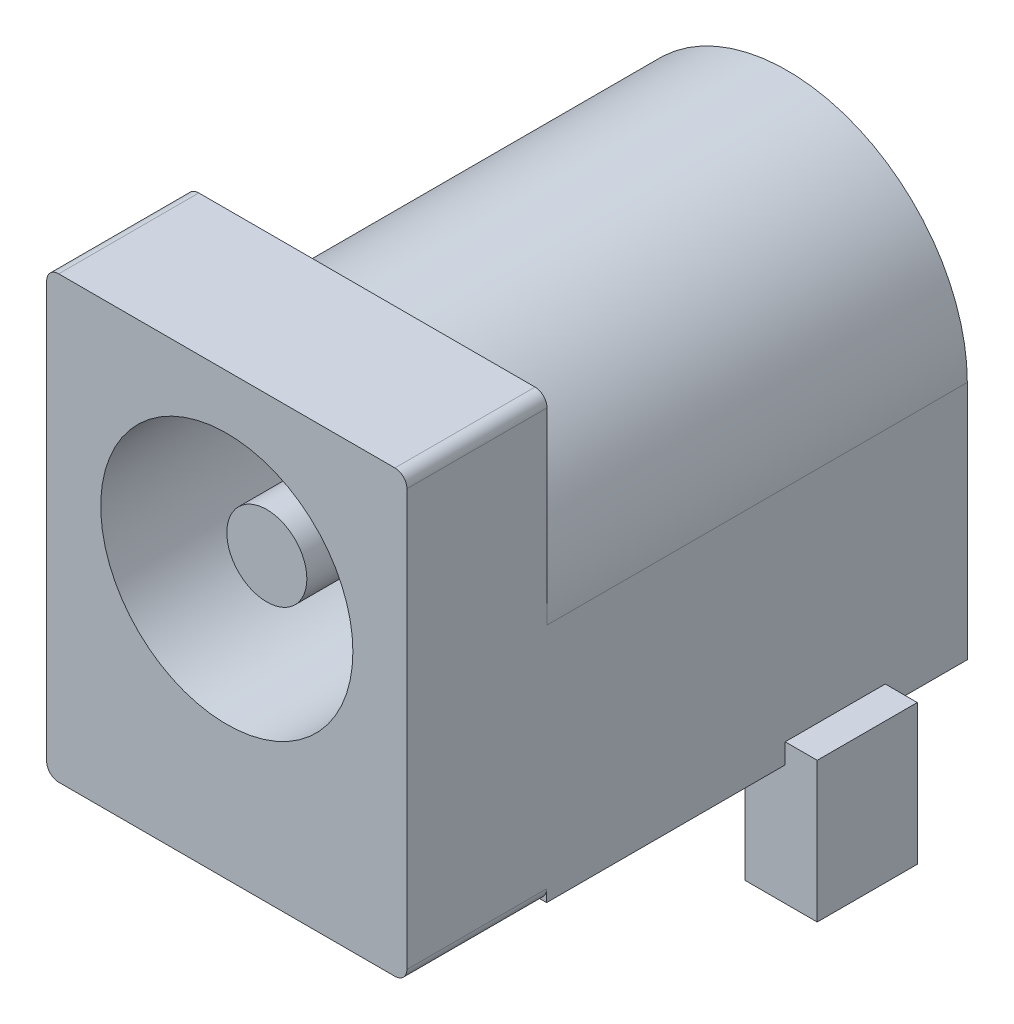
ISO-10303-21;
HEADER;
FILE_DESCRIPTION(('STEP AP214'),'2;1');
FILE_NAME('part.step','',(''),(''),'','','');
FILE_SCHEMA(('AUTOMOTIVE_DESIGN { 1 0 10303 214 1 1 1 1 }'));
ENDSEC;
DATA;
#1=APPLICATION_CONTEXT('core data for automotive mechanical design processes');
#2=APPLICATION_PROTOCOL_DEFINITION('international standard','automotive_design',2000,#1);
#3=PRODUCT_CONTEXT('',#1,'mechanical');
#4=PRODUCT('Part','Part','',(#3));
#5=PRODUCT_RELATED_PRODUCT_CATEGORY('part','',(#4));
#6=PRODUCT_DEFINITION_FORMATION('','',#4);
#7=PRODUCT_DEFINITION_CONTEXT('part definition',#1,'design');
#8=PRODUCT_DEFINITION('design','',#6,#7);
#9=PRODUCT_DEFINITION_SHAPE('','',#8);
#10=(LENGTH_UNIT() NAMED_UNIT(*) SI_UNIT(.MILLI.,.METRE.));
#11=(NAMED_UNIT(*) PLANE_ANGLE_UNIT() SI_UNIT($,.RADIAN.));
#12=(NAMED_UNIT(*) SI_UNIT($,.STERADIAN.) SOLID_ANGLE_UNIT());
#13=UNCERTAINTY_MEASURE_WITH_UNIT(LENGTH_MEASURE(1.E-05),#10,'distance_accuracy_value','');
#14=(GEOMETRIC_REPRESENTATION_CONTEXT(3) GLOBAL_UNCERTAINTY_ASSIGNED_CONTEXT((#13)) GLOBAL_UNIT_ASSIGNED_CONTEXT((#10,
#11,#12)) REPRESENTATION_CONTEXT('',''));
#15=CARTESIAN_POINT('',(0.,0.,0.));
#16=DIRECTION('',(0.,0.,1.));
#17=DIRECTION('',(1.,0.,0.));
#18=AXIS2_PLACEMENT_3D('',#15,#16,#17);
#19=CARTESIAN_POINT('',(0.,0.,-1.8));
#20=DIRECTION('',(0.,0.,1.));
#21=DIRECTION('',(1.,0.,0.));
#22=AXIS2_PLACEMENT_3D('',#19,#20,#21);
#23=PLANE('',#22);
#24=CARTESIAN_POINT('',(0.,0.,-1.8));
#25=DIRECTION('',(0.,0.,1.));
#26=DIRECTION('',(1.,0.,0.));
#27=AXIS2_PLACEMENT_3D('',#24,#25,#26);
#28=CIRCLE('',#27,1.);
#29=CARTESIAN_POINT('',(1.,0.,-1.8));
#30=VERTEX_POINT('',#29);
#31=EDGE_CURVE('E11',#30,#30,#28,.T.);
#32=ORIENTED_EDGE('',*,*,#31,.T.);
#33=EDGE_LOOP('',(#32));
#34=FACE_BOUND('',#33,.T.);
#35=ADVANCED_FACE('F17',(#34),#23,.T.);
#36=CARTESIAN_POINT('',(0.,0.,-10.5));
#37=DIRECTION('',(0.,0.,-1.));
#38=DIRECTION('',(1.,0.,0.));
#39=AXIS2_PLACEMENT_3D('',#36,#37,#38);
#40=CYLINDRICAL_SURFACE('',#39,1.);
#41=ORIENTED_EDGE('',*,*,#31,.F.);
#42=EDGE_LOOP('',(#41));
#43=FACE_BOUND('',#42,.T.);
#44=CARTESIAN_POINT('',(0.,0.,-10.4));
#45=DIRECTION('',(0.,0.,-1.));
#46=DIRECTION('',(1.,0.,0.));
#47=AXIS2_PLACEMENT_3D('',#44,#45,#46);
#48=CIRCLE('',#47,1.);
#49=CARTESIAN_POINT('',(1.,0.,-10.4));
#50=VERTEX_POINT('',#49);
#51=EDGE_CURVE('E313',#50,#50,#48,.T.);
#52=ORIENTED_EDGE('',*,*,#51,.F.);
#53=EDGE_LOOP('',(#52));
#54=FACE_BOUND('',#53,.T.);
#55=ADVANCED_FACE('F897',(#43,#54),#40,.T.);
#56=CARTESIAN_POINT('',(-0.4,-9.5,-10.));
#57=DIRECTION('',(0.,1.,0.));
#58=DIRECTION('',(1.,0.,0.));
#59=AXIS2_PLACEMENT_3D('',#56,#57,#58);
#60=PLANE('',#59);
#61=DIRECTION('',(0.,0.,1.));
#62=VECTOR('',#61,1.);
#63=CARTESIAN_POINT('',(0.4,-9.5,-10.));
#64=LINE('',#63,#62);
#65=CARTESIAN_POINT('',(0.4,-9.5,-10.));
#66=VERTEX_POINT('',#65);
#67=CARTESIAN_POINT('',(0.4,-9.5,-7.2));
#68=VERTEX_POINT('',#67);
#69=EDGE_CURVE('E225',#66,#68,#64,.T.);
#70=ORIENTED_EDGE('',*,*,#69,.T.);
#71=DIRECTION('',(1.,0.,0.));
#72=VECTOR('',#71,1.);
#73=CARTESIAN_POINT('',(-0.4,-9.5,-7.2));
#74=LINE('',#73,#72);
#75=CARTESIAN_POINT('',(-0.4,-9.5,-7.2));
#76=VERTEX_POINT('',#75);
#77=EDGE_CURVE('E304',#76,#68,#74,.T.);
#78=ORIENTED_EDGE('',*,*,#77,.F.);
#79=DIRECTION('',(0.,0.,1.));
#80=VECTOR('',#79,1.);
#81=CARTESIAN_POINT('',(-0.4,-9.5,-10.));
#82=LINE('',#81,#80);
#83=CARTESIAN_POINT('',(-0.4,-9.5,-10.));
#84=VERTEX_POINT('',#83);
#85=EDGE_CURVE('E235',#84,#76,#82,.T.);
#86=ORIENTED_EDGE('',*,*,#85,.F.);
#87=DIRECTION('',(1.,0.,0.));
#88=VECTOR('',#87,1.);
#89=CARTESIAN_POINT('',(-0.4,-9.5,-10.));
#90=LINE('',#89,#88);
#91=EDGE_CURVE('E36',#84,#66,#90,.T.);
#92=ORIENTED_EDGE('',*,*,#91,.T.);
#93=EDGE_LOOP('',(#70,#78,#86,#92));
#94=FACE_BOUND('',#93,.T.);
#95=ADVANCED_FACE('F903',(#94),#60,.F.);
#96=CARTESIAN_POINT('',(3.5,-9.5,-12.75));
#97=DIRECTION('',(0.,1.,0.));
#98=DIRECTION('',(1.,0.,0.));
#99=AXIS2_PLACEMENT_3D('',#96,#97,#98);
#100=PLANE('',#99);
#101=DIRECTION('',(0.,0.,1.));
#102=VECTOR('',#101,1.);
#103=CARTESIAN_POINT('',(5.3,-9.5,-12.75));
#104=LINE('',#103,#102);
#105=CARTESIAN_POINT('',(5.3,-9.5,-12.75));
#106=VERTEX_POINT('',#105);
#107=CARTESIAN_POINT('',(5.3,-9.5,-10.25));
#108=VERTEX_POINT('',#107);
#109=EDGE_CURVE('E27',#106,#108,#104,.T.);
#110=ORIENTED_EDGE('',*,*,#109,.T.);
#111=DIRECTION('',(1.,0.,0.));
#112=VECTOR('',#111,1.);
#113=CARTESIAN_POINT('',(3.5,-9.5,-10.25));
#114=LINE('',#113,#112);
#115=CARTESIAN_POINT('',(3.5,-9.5,-10.25));
#116=VERTEX_POINT('',#115);
#117=EDGE_CURVE('E392',#116,#108,#114,.T.);
#118=ORIENTED_EDGE('',*,*,#117,.F.);
#119=DIRECTION('',(0.,0.,1.));
#120=VECTOR('',#119,1.);
#121=CARTESIAN_POINT('',(3.5,-9.5,-12.75));
#122=LINE('',#121,#120);
#123=CARTESIAN_POINT('',(3.5,-9.5,-12.75));
#124=VERTEX_POINT('',#123);
#125=EDGE_CURVE('E485',#124,#116,#122,.T.);
#126=ORIENTED_EDGE('',*,*,#125,.F.);
#127=DIRECTION('',(1.,0.,0.));
#128=VECTOR('',#127,1.);
#129=CARTESIAN_POINT('',(3.5,-9.5,-12.75));
#130=LINE('',#129,#128);
#131=EDGE_CURVE('E459',#124,#106,#130,.T.);
#132=ORIENTED_EDGE('',*,*,#131,.T.);
#133=EDGE_LOOP('',(#110,#118,#126,#132));
#134=FACE_BOUND('',#133,.T.);
#135=ADVANCED_FACE('F586',(#134),#100,.F.);
#136=CARTESIAN_POINT('',(5.3,-9.5,-12.75));
#137=DIRECTION('',(1.,0.,0.));
#138=DIRECTION('',(0.,1.,0.));
#139=AXIS2_PLACEMENT_3D('',#136,#137,#138);
#140=PLANE('',#139);
#141=ORIENTED_EDGE('',*,*,#109,.F.);
#142=DIRECTION('',(0.,1.,0.));
#143=VECTOR('',#142,1.);
#144=CARTESIAN_POINT('',(5.3,-9.5,-12.75));
#145=LINE('',#144,#143);
#146=CARTESIAN_POINT('',(5.3,-6.,-12.75));
#147=VERTEX_POINT('',#146);
#148=EDGE_CURVE('E464',#106,#147,#145,.T.);
#149=ORIENTED_EDGE('',*,*,#148,.T.);
#150=DIRECTION('',(0.,0.,1.));
#151=VECTOR('',#150,1.);
#152=CARTESIAN_POINT('',(5.3,-6.,-12.75));
#153=LINE('',#152,#151);
#154=CARTESIAN_POINT('',(5.3,-6.,-10.25));
#155=VERTEX_POINT('',#154);
#156=EDGE_CURVE('E316',#147,#155,#153,.T.);
#157=ORIENTED_EDGE('',*,*,#156,.T.);
#158=DIRECTION('',(0.,1.,0.));
#159=VECTOR('',#158,1.);
#160=CARTESIAN_POINT('',(5.3,-9.5,-10.25));
#161=LINE('',#160,#159);
#162=EDGE_CURVE('E389',#108,#155,#161,.T.);
#163=ORIENTED_EDGE('',*,*,#162,.F.);
#164=EDGE_LOOP('',(#141,#149,#157,#163));
#165=FACE_BOUND('',#164,.T.);
#166=ADVANCED_FACE('F580',(#165),#140,.T.);
#167=CARTESIAN_POINT('',(-0.4,-9.5,-15.9));
#168=DIRECTION('',(0.,1.,0.));
#169=DIRECTION('',(1.,0.,0.));
#170=AXIS2_PLACEMENT_3D('',#167,#168,#169);
#171=PLANE('',#170);
#172=DIRECTION('',(0.,0.,1.));
#173=VECTOR('',#172,1.);
#174=CARTESIAN_POINT('',(0.4,-9.5,-15.9));
#175=LINE('',#174,#173);
#176=CARTESIAN_POINT('',(0.4,-9.5,-15.9));
#177=VERTEX_POINT('',#176);
#178=CARTESIAN_POINT('',(0.4,-9.5,-12.9));
#179=VERTEX_POINT('',#178);
#180=EDGE_CURVE('E337',#177,#179,#175,.T.);
#181=ORIENTED_EDGE('',*,*,#180,.T.);
#182=DIRECTION('',(1.,0.,0.));
#183=VECTOR('',#182,1.);
#184=CARTESIAN_POINT('',(-0.4,-9.5,-12.9));
#185=LINE('',#184,#183);
#186=CARTESIAN_POINT('',(-0.4,-9.5,-12.9));
#187=VERTEX_POINT('',#186);
#188=EDGE_CURVE('E422',#187,#179,#185,.T.);
#189=ORIENTED_EDGE('',*,*,#188,.F.);
#190=DIRECTION('',(0.,0.,1.));
#191=VECTOR('',#190,1.);
#192=CARTESIAN_POINT('',(-0.4,-9.5,-15.9));
#193=LINE('',#192,#191);
#194=CARTESIAN_POINT('',(-0.4,-9.5,-15.9));
#195=VERTEX_POINT('',#194);
#196=EDGE_CURVE('E500',#195,#187,#193,.T.);
#197=ORIENTED_EDGE('',*,*,#196,.F.);
#198=DIRECTION('',(1.,0.,0.));
#199=VECTOR('',#198,1.);
#200=CARTESIAN_POINT('',(-0.4,-9.5,-15.9));
#201=LINE('',#200,#199);
#202=EDGE_CURVE('E312',#195,#177,#201,.T.);
#203=ORIENTED_EDGE('',*,*,#202,.T.);
#204=EDGE_LOOP('',(#181,#189,#197,#203));
#205=FACE_BOUND('',#204,.T.);
#206=ADVANCED_FACE('F627',(#205),#171,.F.);
#207=CARTESIAN_POINT('',(-0.4,-9.5,-15.9));
#208=DIRECTION('',(0.,0.,1.));
#209=DIRECTION('',(1.,0.,0.));
#210=AXIS2_PLACEMENT_3D('',#207,#208,#209);
#211=PLANE('',#210);
#212=DIRECTION('',(1.,0.,0.));
#213=VECTOR('',#212,1.);
#214=CARTESIAN_POINT('',(-0.4,-6.,-15.9));
#215=LINE('',#214,#213);
#216=CARTESIAN_POINT('',(-0.4,-6.,-15.9));
#217=VERTEX_POINT('',#216);
#218=CARTESIAN_POINT('',(0.4,-6.,-15.9));
#219=VERTEX_POINT('',#218);
#220=EDGE_CURVE('E535',#217,#219,#215,.T.);
#221=ORIENTED_EDGE('',*,*,#220,.T.);
#222=DIRECTION('',(0.,1.,0.));
#223=VECTOR('',#222,1.);
#224=CARTESIAN_POINT('',(0.4,-9.5,-15.9));
#225=LINE('',#224,#223);
#226=EDGE_CURVE('E335',#177,#219,#225,.T.);
#227=ORIENTED_EDGE('',*,*,#226,.F.);
#228=ORIENTED_EDGE('',*,*,#202,.F.);
#229=DIRECTION('',(0.,1.,0.));
#230=VECTOR('',#229,1.);
#231=CARTESIAN_POINT('',(-0.4,-9.5,-15.9));
#232=LINE('',#231,#230);
#233=EDGE_CURVE('E533',#195,#217,#232,.T.);
#234=ORIENTED_EDGE('',*,*,#233,.T.);
#235=EDGE_LOOP('',(#221,#227,#228,#234));
#236=FACE_BOUND('',#235,.T.);
#237=ADVANCED_FACE('F634',(#236),#211,.F.);
#238=CARTESIAN_POINT('',(0.,0.,-10.4));
#239=DIRECTION('',(0.,0.,1.));
#240=DIRECTION('',(1.,0.,0.));
#241=AXIS2_PLACEMENT_3D('',#238,#239,#240);
#242=PLANE('',#241);
#243=ORIENTED_EDGE('',*,*,#51,.T.);
#244=EDGE_LOOP('',(#243));
#245=FACE_BOUND('',#244,.T.);
#246=CARTESIAN_POINT('',(0.,0.,-10.4));
#247=DIRECTION('',(0.,0.,1.));
#248=DIRECTION('',(1.,0.,0.));
#249=AXIS2_PLACEMENT_3D('',#246,#247,#248);
#250=CIRCLE('',#249,3.15);
#251=CARTESIAN_POINT('',(3.15,0.,-10.4));
#252=VERTEX_POINT('',#251);
#253=EDGE_CURVE('E521',#252,#252,#250,.T.);
#254=ORIENTED_EDGE('',*,*,#253,.T.);
#255=EDGE_LOOP('',(#254));
#256=FACE_BOUND('',#255,.T.);
#257=ADVANCED_FACE('F1033',(#245,#256),#242,.T.);
#258=CARTESIAN_POINT('',(3.5,-6.,-12.75));
#259=DIRECTION('',(0.,1.,0.));
#260=DIRECTION('',(1.,0.,0.));
#261=AXIS2_PLACEMENT_3D('',#258,#259,#260);
#262=PLANE('',#261);
#263=DIRECTION('',(1.,0.,0.));
#264=VECTOR('',#263,1.);
#265=CARTESIAN_POINT('',(3.5,-6.,-12.75));
#266=LINE('',#265,#264);
#267=CARTESIAN_POINT('',(4.5,-6.,-12.75));
#268=VERTEX_POINT('',#267);
#269=EDGE_CURVE('E546',#268,#147,#266,.T.);
#270=ORIENTED_EDGE('',*,*,#269,.F.);
#271=DIRECTION('',(0.,0.,1.));
#272=VECTOR('',#271,1.);
#273=CARTESIAN_POINT('',(4.5,-6.,-8.525));
#274=LINE('',#273,#272);
#275=CARTESIAN_POINT('',(4.5,-6.,-10.25));
#276=VERTEX_POINT('',#275);
#277=EDGE_CURVE('E520',#268,#276,#274,.T.);
#278=ORIENTED_EDGE('',*,*,#277,.T.);
#279=DIRECTION('',(1.,0.,0.));
#280=VECTOR('',#279,1.);
#281=CARTESIAN_POINT('',(3.5,-6.,-10.25));
#282=LINE('',#281,#280);
#283=EDGE_CURVE('E301',#276,#155,#282,.T.);
#284=ORIENTED_EDGE('',*,*,#283,.T.);
#285=ORIENTED_EDGE('',*,*,#156,.F.);
#286=EDGE_LOOP('',(#270,#278,#284,#285));
#287=FACE_BOUND('',#286,.T.);
#288=ADVANCED_FACE('F578',(#287),#262,.T.);
#289=CARTESIAN_POINT('',(-0.4,-6.,-15.9));
#290=DIRECTION('',(0.,1.,0.));
#291=DIRECTION('',(1.,0.,0.));
#292=AXIS2_PLACEMENT_3D('',#289,#290,#291);
#293=PLANE('',#292);
#294=DIRECTION('',(0.,0.,1.));
#295=VECTOR('',#294,1.);
#296=CARTESIAN_POINT('',(0.4,-6.,-15.9));
#297=LINE('',#296,#295);
#298=CARTESIAN_POINT('',(0.4,-6.,-14.8));
#299=VERTEX_POINT('',#298);
#300=EDGE_CURVE('E336',#219,#299,#297,.T.);
#301=ORIENTED_EDGE('',*,*,#300,.F.);
#302=ORIENTED_EDGE('',*,*,#220,.F.);
#303=DIRECTION('',(0.,0.,1.));
#304=VECTOR('',#303,1.);
#305=CARTESIAN_POINT('',(-0.4,-6.,-15.9));
#306=LINE('',#305,#304);
#307=CARTESIAN_POINT('',(-0.4,-6.,-14.8));
#308=VERTEX_POINT('',#307);
#309=EDGE_CURVE('E526',#217,#308,#306,.T.);
#310=ORIENTED_EDGE('',*,*,#309,.T.);
#311=DIRECTION('',(-1.,0.,0.));
#312=VECTOR('',#311,1.);
#313=CARTESIAN_POINT('',(-2.45,-6.,-14.8));
#314=LINE('',#313,#312);
#315=EDGE_CURVE('E444',#299,#308,#314,.T.);
#316=ORIENTED_EDGE('',*,*,#315,.F.);
#317=EDGE_LOOP('',(#301,#302,#310,#316));
#318=FACE_BOUND('',#317,.T.);
#319=ADVANCED_FACE('F633',(#318),#293,.T.);
#320=CARTESIAN_POINT('',(-0.4,-9.5,-10.));
#321=DIRECTION('',(0.,0.,1.));
#322=DIRECTION('',(1.,0.,0.));
#323=AXIS2_PLACEMENT_3D('',#320,#321,#322);
#324=PLANE('',#323);
#325=DIRECTION('',(1.,0.,0.));
#326=VECTOR('',#325,1.);
#327=CARTESIAN_POINT('',(-2.45,-6.5,-10.));
#328=LINE('',#327,#326);
#329=CARTESIAN_POINT('',(-0.4,-6.5,-10.));
#330=VERTEX_POINT('',#329);
#331=CARTESIAN_POINT('',(0.4,-6.5,-10.));
#332=VERTEX_POINT('',#331);
#333=EDGE_CURVE('E319',#330,#332,#328,.T.);
#334=ORIENTED_EDGE('',*,*,#333,.T.);
#335=DIRECTION('',(0.,1.,0.));
#336=VECTOR('',#335,1.);
#337=CARTESIAN_POINT('',(0.4,-9.5,-10.));
#338=LINE('',#337,#336);
#339=EDGE_CURVE('E506',#66,#332,#338,.T.);
#340=ORIENTED_EDGE('',*,*,#339,.F.);
#341=ORIENTED_EDGE('',*,*,#91,.F.);
#342=DIRECTION('',(0.,1.,0.));
#343=VECTOR('',#342,1.);
#344=CARTESIAN_POINT('',(-0.4,-9.5,-10.));
#345=LINE('',#344,#343);
#346=EDGE_CURVE('E383',#84,#330,#345,.T.);
#347=ORIENTED_EDGE('',*,*,#346,.T.);
#348=EDGE_LOOP('',(#334,#340,#341,#347));
#349=FACE_BOUND('',#348,.T.);
#350=ADVANCED_FACE('F1007',(#349),#324,.F.);
#351=CARTESIAN_POINT('',(0.4,-9.5,-10.));
#352=DIRECTION('',(1.,0.,0.));
#353=DIRECTION('',(0.,1.,0.));
#354=AXIS2_PLACEMENT_3D('',#351,#352,#353);
#355=PLANE('',#354);
#356=DIRECTION('',(0.,1.,0.));
#357=VECTOR('',#356,1.);
#358=CARTESIAN_POINT('',(0.4,-9.5,-7.2));
#359=LINE('',#358,#357);
#360=CARTESIAN_POINT('',(0.4,-6.5,-7.2));
#361=VERTEX_POINT('',#360);
#362=EDGE_CURVE('E381',#68,#361,#359,.T.);
#363=ORIENTED_EDGE('',*,*,#362,.F.);
#364=ORIENTED_EDGE('',*,*,#69,.F.);
#365=ORIENTED_EDGE('',*,*,#339,.T.);
#366=DIRECTION('',(0.,0.,-1.));
#367=VECTOR('',#366,1.);
#368=CARTESIAN_POINT('',(0.4,-6.5,-7.15));
#369=LINE('',#368,#367);
#370=EDGE_CURVE('E324',#361,#332,#369,.T.);
#371=ORIENTED_EDGE('',*,*,#370,.F.);
#372=EDGE_LOOP('',(#363,#364,#365,#371));
#373=FACE_BOUND('',#372,.T.);
#374=ADVANCED_FACE('F1001',(#373),#355,.T.);
#375=CARTESIAN_POINT('',(-0.4,-9.5,-10.));
#376=DIRECTION('',(1.,0.,0.));
#377=DIRECTION('',(0.,1.,0.));
#378=AXIS2_PLACEMENT_3D('',#375,#376,#377);
#379=PLANE('',#378);
#380=DIRECTION('',(0.,0.,-1.));
#381=VECTOR('',#380,1.);
#382=CARTESIAN_POINT('',(-0.4,-6.5,-7.15));
#383=LINE('',#382,#381);
#384=CARTESIAN_POINT('',(-0.4,-6.5,-7.2));
#385=VERTEX_POINT('',#384);
#386=EDGE_CURVE('E322',#385,#330,#383,.T.);
#387=ORIENTED_EDGE('',*,*,#386,.T.);
#388=ORIENTED_EDGE('',*,*,#346,.F.);
#389=ORIENTED_EDGE('',*,*,#85,.T.);
#390=DIRECTION('',(0.,1.,0.));
#391=VECTOR('',#390,1.);
#392=CARTESIAN_POINT('',(-0.4,-9.5,-7.2));
#393=LINE('',#392,#391);
#394=EDGE_CURVE('E299',#76,#385,#393,.T.);
#395=ORIENTED_EDGE('',*,*,#394,.T.);
#396=EDGE_LOOP('',(#387,#388,#389,#395));
#397=FACE_BOUND('',#396,.T.);
#398=ADVANCED_FACE('F995',(#397),#379,.F.);
#399=CARTESIAN_POINT('',(-0.4,-9.5,-7.2));
#400=DIRECTION('',(0.,0.,1.));
#401=DIRECTION('',(1.,0.,0.));
#402=AXIS2_PLACEMENT_3D('',#399,#400,#401);
#403=PLANE('',#402);
#404=ORIENTED_EDGE('',*,*,#394,.F.);
#405=ORIENTED_EDGE('',*,*,#77,.T.);
#406=ORIENTED_EDGE('',*,*,#362,.T.);
#407=DIRECTION('',(1.,0.,0.));
#408=VECTOR('',#407,1.);
#409=CARTESIAN_POINT('',(-2.45,-6.5,-7.2));
#410=LINE('',#409,#408);
#411=EDGE_CURVE('E355',#385,#361,#410,.T.);
#412=ORIENTED_EDGE('',*,*,#411,.F.);
#413=EDGE_LOOP('',(#404,#405,#406,#412));
#414=FACE_BOUND('',#413,.T.);
#415=ADVANCED_FACE('F983',(#414),#403,.T.);
#416=CARTESIAN_POINT('',(-4.5,-6.5,-4.29));
#417=DIRECTION('',(0.,0.,1.));
#418=DIRECTION('',(1.,0.,0.));
#419=AXIS2_PLACEMENT_3D('',#416,#417,#418);
#420=PLANE('',#419);
#421=DIRECTION('',(1.,0.,0.));
#422=VECTOR('',#421,1.);
#423=CARTESIAN_POINT('',(-4.5,-6.5,-4.29));
#424=LINE('',#423,#422);
#425=CARTESIAN_POINT('',(4.2,-6.5,-4.29));
#426=VERTEX_POINT('',#425);
#427=CARTESIAN_POINT('',(4.5,-6.5,-4.29));
#428=VERTEX_POINT('',#427);
#429=EDGE_CURVE('E450',#426,#428,#424,.T.);
#430=ORIENTED_EDGE('',*,*,#429,.T.);
#431=DIRECTION('',(0.,1.,0.));
#432=VECTOR('',#431,1.);
#433=CARTESIAN_POINT('',(4.5,-6.5,-4.29));
#434=LINE('',#433,#432);
#435=CARTESIAN_POINT('',(4.5,-6.2,-4.29));
#436=VERTEX_POINT('',#435);
#437=EDGE_CURVE('E515',#428,#436,#434,.T.);
#438=ORIENTED_EDGE('',*,*,#437,.T.);
#439=CARTESIAN_POINT('',(4.2,-6.2,-4.29));
#440=DIRECTION('',(0.,0.,1.));
#441=DIRECTION('',(1.,0.,0.));
#442=AXIS2_PLACEMENT_3D('',#439,#440,#441);
#443=CIRCLE('',#442,0.3);
#444=EDGE_CURVE('E358',#426,#436,#443,.T.);
#445=ORIENTED_EDGE('',*,*,#444,.F.);
#446=EDGE_LOOP('',(#430,#438,#445));
#447=FACE_BOUND('',#446,.T.);
#448=ADVANCED_FACE('F972',(#447),#420,.T.);
#449=CARTESIAN_POINT('',(3.5,-9.5,-10.25));
#450=DIRECTION('',(0.,0.,1.));
#451=DIRECTION('',(1.,0.,0.));
#452=AXIS2_PLACEMENT_3D('',#449,#450,#451);
#453=PLANE('',#452);
#454=DIRECTION('',(0.,1.,0.));
#455=VECTOR('',#454,1.);
#456=CARTESIAN_POINT('',(3.5,-9.5,-10.25));
#457=LINE('',#456,#455);
#458=CARTESIAN_POINT('',(3.5,-6.5,-10.25));
#459=VERTEX_POINT('',#458);
#460=EDGE_CURVE('E486',#116,#459,#457,.T.);
#461=ORIENTED_EDGE('',*,*,#460,.F.);
#462=ORIENTED_EDGE('',*,*,#117,.T.);
#463=ORIENTED_EDGE('',*,*,#162,.T.);
#464=ORIENTED_EDGE('',*,*,#283,.F.);
#465=DIRECTION('',(0.,-1.,0.));
#466=VECTOR('',#465,1.);
#467=CARTESIAN_POINT('',(4.5,-8.,-10.25));
#468=LINE('',#467,#466);
#469=CARTESIAN_POINT('',(4.5,-6.5,-10.25));
#470=VERTEX_POINT('',#469);
#471=EDGE_CURVE('E512',#276,#470,#468,.T.);
#472=ORIENTED_EDGE('',*,*,#471,.T.);
#473=DIRECTION('',(1.,0.,0.));
#474=VECTOR('',#473,1.);
#475=CARTESIAN_POINT('',(-0.5,-6.5,-10.25));
#476=LINE('',#475,#474);
#477=EDGE_CURVE('E437',#459,#470,#476,.T.);
#478=ORIENTED_EDGE('',*,*,#477,.F.);
#479=EDGE_LOOP('',(#461,#462,#463,#464,#472,#478));
#480=FACE_BOUND('',#479,.T.);
#481=ADVANCED_FACE('F584',(#480),#453,.T.);
#482=CARTESIAN_POINT('',(3.5,-9.5,-12.75));
#483=DIRECTION('',(1.,0.,0.));
#484=DIRECTION('',(0.,1.,0.));
#485=AXIS2_PLACEMENT_3D('',#482,#483,#484);
#486=PLANE('',#485);
#487=DIRECTION('',(0.,0.,-1.));
#488=VECTOR('',#487,1.);
#489=CARTESIAN_POINT('',(3.5,-6.5,-8.525));
#490=LINE('',#489,#488);
#491=CARTESIAN_POINT('',(3.5,-6.5,-12.75));
#492=VERTEX_POINT('',#491);
#493=EDGE_CURVE('E432',#459,#492,#490,.T.);
#494=ORIENTED_EDGE('',*,*,#493,.T.);
#495=DIRECTION('',(0.,1.,0.));
#496=VECTOR('',#495,1.);
#497=CARTESIAN_POINT('',(3.5,-9.5,-12.75));
#498=LINE('',#497,#496);
#499=EDGE_CURVE('E463',#124,#492,#498,.T.);
#500=ORIENTED_EDGE('',*,*,#499,.F.);
#501=ORIENTED_EDGE('',*,*,#125,.T.);
#502=ORIENTED_EDGE('',*,*,#460,.T.);
#503=EDGE_LOOP('',(#494,#500,#501,#502));
#504=FACE_BOUND('',#503,.T.);
#505=ADVANCED_FACE('F958',(#504),#486,.F.);
#506=CARTESIAN_POINT('',(3.5,-9.5,-12.75));
#507=DIRECTION('',(0.,0.,1.));
#508=DIRECTION('',(1.,0.,0.));
#509=AXIS2_PLACEMENT_3D('',#506,#507,#508);
#510=PLANE('',#509);
#511=DIRECTION('',(1.,0.,0.));
#512=VECTOR('',#511,1.);
#513=CARTESIAN_POINT('',(-0.5,-6.5,-12.75));
#514=LINE('',#513,#512);
#515=CARTESIAN_POINT('',(4.5,-6.5,-12.75));
#516=VERTEX_POINT('',#515);
#517=EDGE_CURVE('E424',#492,#516,#514,.T.);
#518=ORIENTED_EDGE('',*,*,#517,.T.);
#519=DIRECTION('',(0.,-1.,0.));
#520=VECTOR('',#519,1.);
#521=CARTESIAN_POINT('',(4.5,-8.,-12.75));
#522=LINE('',#521,#520);
#523=EDGE_CURVE('E522',#268,#516,#522,.T.);
#524=ORIENTED_EDGE('',*,*,#523,.F.);
#525=ORIENTED_EDGE('',*,*,#269,.T.);
#526=ORIENTED_EDGE('',*,*,#148,.F.);
#527=ORIENTED_EDGE('',*,*,#131,.F.);
#528=ORIENTED_EDGE('',*,*,#499,.T.);
#529=EDGE_LOOP('',(#518,#524,#525,#526,#527,#528));
#530=FACE_BOUND('',#529,.T.);
#531=ADVANCED_FACE('F595',(#530),#510,.F.);
#532=CARTESIAN_POINT('',(0.4,-9.5,-15.9));
#533=DIRECTION('',(1.,0.,0.));
#534=DIRECTION('',(0.,1.,0.));
#535=AXIS2_PLACEMENT_3D('',#532,#533,#534);
#536=PLANE('',#535);
#537=DIRECTION('',(0.,1.,0.));
#538=VECTOR('',#537,1.);
#539=CARTESIAN_POINT('',(0.4,-9.5,-12.9));
#540=LINE('',#539,#538);
#541=CARTESIAN_POINT('',(0.4,-6.5,-12.9));
#542=VERTEX_POINT('',#541);
#543=EDGE_CURVE('E427',#179,#542,#540,.T.);
#544=ORIENTED_EDGE('',*,*,#543,.F.);
#545=ORIENTED_EDGE('',*,*,#180,.F.);
#546=ORIENTED_EDGE('',*,*,#226,.T.);
#547=ORIENTED_EDGE('',*,*,#300,.T.);
#548=DIRECTION('',(0.,1.,0.));
#549=VECTOR('',#548,1.);
#550=CARTESIAN_POINT('',(0.4,-8.,-14.8));
#551=LINE('',#550,#549);
#552=CARTESIAN_POINT('',(0.4,-6.5,-14.8));
#553=VERTEX_POINT('',#552);
#554=EDGE_CURVE('E298',#553,#299,#551,.T.);
#555=ORIENTED_EDGE('',*,*,#554,.F.);
#556=DIRECTION('',(0.,0.,-1.));
#557=VECTOR('',#556,1.);
#558=CARTESIAN_POINT('',(0.4,-6.5,-10.1));
#559=LINE('',#558,#557);
#560=EDGE_CURVE('E415',#542,#553,#559,.T.);
#561=ORIENTED_EDGE('',*,*,#560,.F.);
#562=EDGE_LOOP('',(#544,#545,#546,#547,#555,#561));
#563=FACE_BOUND('',#562,.T.);
#564=ADVANCED_FACE('F620',(#563),#536,.T.);
#565=CARTESIAN_POINT('',(-0.4,-9.5,-12.9));
#566=DIRECTION('',(0.,0.,1.));
#567=DIRECTION('',(1.,0.,0.));
#568=AXIS2_PLACEMENT_3D('',#565,#566,#567);
#569=PLANE('',#568);
#570=DIRECTION('',(0.,1.,0.));
#571=VECTOR('',#570,1.);
#572=CARTESIAN_POINT('',(-0.4,-9.5,-12.9));
#573=LINE('',#572,#571);
#574=CARTESIAN_POINT('',(-0.4,-6.5,-12.9));
#575=VERTEX_POINT('',#574);
#576=EDGE_CURVE('E429',#187,#575,#573,.T.);
#577=ORIENTED_EDGE('',*,*,#576,.F.);
#578=ORIENTED_EDGE('',*,*,#188,.T.);
#579=ORIENTED_EDGE('',*,*,#543,.T.);
#580=DIRECTION('',(1.,0.,0.));
#581=VECTOR('',#580,1.);
#582=CARTESIAN_POINT('',(-2.45,-6.5,-12.9));
#583=LINE('',#582,#581);
#584=EDGE_CURVE('E380',#575,#542,#583,.T.);
#585=ORIENTED_EDGE('',*,*,#584,.F.);
#586=EDGE_LOOP('',(#577,#578,#579,#585));
#587=FACE_BOUND('',#586,.T.);
#588=ADVANCED_FACE('F614',(#587),#569,.T.);
#589=CARTESIAN_POINT('',(-0.4,-9.5,-15.9));
#590=DIRECTION('',(1.,0.,0.));
#591=DIRECTION('',(0.,1.,0.));
#592=AXIS2_PLACEMENT_3D('',#589,#590,#591);
#593=PLANE('',#592);
#594=DIRECTION('',(0.,0.,-1.));
#595=VECTOR('',#594,1.);
#596=CARTESIAN_POINT('',(-0.4,-6.5,-10.1));
#597=LINE('',#596,#595);
#598=CARTESIAN_POINT('',(-0.4,-6.5,-14.8));
#599=VERTEX_POINT('',#598);
#600=EDGE_CURVE('E373',#575,#599,#597,.T.);
#601=ORIENTED_EDGE('',*,*,#600,.T.);
#602=DIRECTION('',(0.,1.,0.));
#603=VECTOR('',#602,1.);
#604=CARTESIAN_POINT('',(-0.4,-8.,-14.8));
#605=LINE('',#604,#603);
#606=EDGE_CURVE('E275',#599,#308,#605,.T.);
#607=ORIENTED_EDGE('',*,*,#606,.T.);
#608=ORIENTED_EDGE('',*,*,#309,.F.);
#609=ORIENTED_EDGE('',*,*,#233,.F.);
#610=ORIENTED_EDGE('',*,*,#196,.T.);
#611=ORIENTED_EDGE('',*,*,#576,.T.);
#612=EDGE_LOOP('',(#601,#607,#608,#609,#610,#611));
#613=FACE_BOUND('',#612,.T.);
#614=ADVANCED_FACE('F623',(#613),#593,.F.);
#615=CARTESIAN_POINT('',(0.,0.,-0.8));
#616=DIRECTION('',(0.,0.,1.));
#617=DIRECTION('',(1.,0.,0.));
#618=AXIS2_PLACEMENT_3D('',#615,#616,#617);
#619=CYLINDRICAL_SURFACE('',#618,3.15);
#620=ORIENTED_EDGE('',*,*,#253,.F.);
#621=EDGE_LOOP('',(#620));
#622=FACE_BOUND('',#621,.T.);
#623=CARTESIAN_POINT('',(0.,0.,-0.8));
#624=DIRECTION('',(0.,0.,1.));
#625=DIRECTION('',(1.,0.,0.));
#626=AXIS2_PLACEMENT_3D('',#623,#624,#625);
#627=CIRCLE('',#626,3.15);
#628=CARTESIAN_POINT('',(3.15,0.,-0.8));
#629=VERTEX_POINT('',#628);
#630=EDGE_CURVE('E303',#629,#629,#627,.T.);
#631=ORIENTED_EDGE('',*,*,#630,.T.);
#632=EDGE_LOOP('',(#631));
#633=FACE_BOUND('',#632,.T.);
#634=ADVANCED_FACE('F929',(#622,#633),#619,.F.);
#635=CARTESIAN_POINT('',(4.5,-6.5,-4.3));
#636=DIRECTION('',(1.,0.,0.));
#637=DIRECTION('',(0.,1.,0.));
#638=AXIS2_PLACEMENT_3D('',#635,#636,#637);
#639=PLANE('',#638);
#640=DIRECTION('',(0.,1.,0.));
#641=VECTOR('',#640,1.);
#642=CARTESIAN_POINT('',(4.5,-6.5,-0.8));
#643=LINE('',#642,#641);
#644=CARTESIAN_POINT('',(4.5,-6.2,-0.8));
#645=VERTEX_POINT('',#644);
#646=CARTESIAN_POINT('',(4.5,4.2,-0.8));
#647=VERTEX_POINT('',#646);
#648=EDGE_CURVE('E356',#645,#647,#643,.T.);
#649=ORIENTED_EDGE('',*,*,#648,.F.);
#650=DIRECTION('',(0.,0.,1.));
#651=VECTOR('',#650,1.);
#652=CARTESIAN_POINT('',(4.5,-6.2,-4.3));
#653=LINE('',#652,#651);
#654=EDGE_CURVE('E365',#436,#645,#653,.T.);
#655=ORIENTED_EDGE('',*,*,#654,.F.);
#656=ORIENTED_EDGE('',*,*,#437,.F.);
#657=DIRECTION('',(0.,0.,1.));
#658=VECTOR('',#657,1.);
#659=CARTESIAN_POINT('',(4.5,-6.5,-14.8));
#660=LINE('',#659,#658);
#661=EDGE_CURVE('E445',#470,#428,#660,.T.);
#662=ORIENTED_EDGE('',*,*,#661,.F.);
#663=ORIENTED_EDGE('',*,*,#471,.F.);
#664=ORIENTED_EDGE('',*,*,#277,.F.);
#665=ORIENTED_EDGE('',*,*,#523,.T.);
#666=DIRECTION('',(0.,0.,1.));
#667=VECTOR('',#666,1.);
#668=CARTESIAN_POINT('',(4.5,-6.5,-14.8));
#669=LINE('',#668,#667);
#670=CARTESIAN_POINT('',(4.5,-6.5,-14.8));
#671=VERTEX_POINT('',#670);
#672=EDGE_CURVE('E419',#671,#516,#669,.T.);
#673=ORIENTED_EDGE('',*,*,#672,.F.);
#674=DIRECTION('',(0.,1.,0.));
#675=VECTOR('',#674,1.);
#676=CARTESIAN_POINT('',(4.5,-6.5,-14.8));
#677=LINE('',#676,#675);
#678=CARTESIAN_POINT('',(4.5,-0.5,-14.8));
#679=VERTEX_POINT('',#678);
#680=EDGE_CURVE('E271',#671,#679,#677,.T.);
#681=ORIENTED_EDGE('',*,*,#680,.T.);
#682=DIRECTION('',(0.,0.,1.));
#683=VECTOR('',#682,1.);
#684=CARTESIAN_POINT('',(4.5,-0.5,-14.8));
#685=LINE('',#684,#683);
#686=CARTESIAN_POINT('',(4.5,-0.5,-4.3));
#687=VERTEX_POINT('',#686);
#688=EDGE_CURVE('E270',#679,#687,#685,.T.);
#689=ORIENTED_EDGE('',*,*,#688,.T.);
#690=DIRECTION('',(0.,1.,0.));
#691=VECTOR('',#690,1.);
#692=CARTESIAN_POINT('',(4.5,-6.5,-4.3));
#693=LINE('',#692,#691);
#694=CARTESIAN_POINT('',(4.5,4.2,-4.3));
#695=VERTEX_POINT('',#694);
#696=EDGE_CURVE('E493',#687,#695,#693,.T.);
#697=ORIENTED_EDGE('',*,*,#696,.T.);
#698=DIRECTION('',(0.,0.,1.));
#699=VECTOR('',#698,1.);
#700=CARTESIAN_POINT('',(4.5,4.2,-4.3));
#701=LINE('',#700,#699);
#702=EDGE_CURVE('E397',#695,#647,#701,.T.);
#703=ORIENTED_EDGE('',*,*,#702,.T.);
#704=EDGE_LOOP('',(#649,#655,#656,#662,#663,#664,#665,#673,#681,#689,#697,#703));
#705=FACE_BOUND('',#704,.T.);
#706=ADVANCED_FACE('F921',(#705),#639,.T.);
#707=CARTESIAN_POINT('',(4.2,4.2,-4.3));
#708=DIRECTION('',(0.,0.,1.));
#709=DIRECTION('',(1.,0.,0.));
#710=AXIS2_PLACEMENT_3D('',#707,#708,#709);
#711=CYLINDRICAL_SURFACE('',#710,0.3);
#712=CARTESIAN_POINT('',(4.2,4.2,-4.3));
#713=DIRECTION('',(0.,0.,1.));
#714=DIRECTION('',(0.,-1.,0.));
#715=AXIS2_PLACEMENT_3D('',#712,#713,#714);
#716=CIRCLE('',#715,0.3);
#717=CARTESIAN_POINT('',(4.2,4.5,-4.3));
#718=VERTEX_POINT('',#717);
#719=EDGE_CURVE('E489',#695,#718,#716,.T.);
#720=ORIENTED_EDGE('',*,*,#719,.T.);
#721=DIRECTION('',(0.,0.,1.));
#722=VECTOR('',#721,1.);
#723=CARTESIAN_POINT('',(4.2,4.5,-4.3));
#724=LINE('',#723,#722);
#725=CARTESIAN_POINT('',(4.2,4.5,-0.8));
#726=VERTEX_POINT('',#725);
#727=EDGE_CURVE('E364',#718,#726,#724,.T.);
#728=ORIENTED_EDGE('',*,*,#727,.T.);
#729=CARTESIAN_POINT('',(4.2,4.2,-0.8));
#730=DIRECTION('',(0.,0.,1.));
#731=DIRECTION('',(0.,-1.,0.));
#732=AXIS2_PLACEMENT_3D('',#729,#730,#731);
#733=CIRCLE('',#732,0.3);
#734=EDGE_CURVE('E368',#647,#726,#733,.T.);
#735=ORIENTED_EDGE('',*,*,#734,.F.);
#736=ORIENTED_EDGE('',*,*,#702,.F.);
#737=EDGE_LOOP('',(#720,#728,#735,#736));
#738=FACE_BOUND('',#737,.T.);
#739=ADVANCED_FACE('F818',(#738),#711,.T.);
#740=CARTESIAN_POINT('',(4.2,-6.2,-4.3));
#741=DIRECTION('',(0.,0.,1.));
#742=DIRECTION('',(1.,0.,0.));
#743=AXIS2_PLACEMENT_3D('',#740,#741,#742);
#744=CYLINDRICAL_SURFACE('',#743,0.3);
#745=CARTESIAN_POINT('',(4.2,-6.2,-0.8));
#746=DIRECTION('',(0.,0.,-1.));
#747=DIRECTION('',(0.,-1.,0.));
#748=AXIS2_PLACEMENT_3D('',#745,#746,#747);
#749=CIRCLE('',#748,0.3);
#750=CARTESIAN_POINT('',(4.2,-6.5,-0.8));
#751=VERTEX_POINT('',#750);
#752=EDGE_CURVE('E329',#645,#751,#749,.T.);
#753=ORIENTED_EDGE('',*,*,#752,.T.);
#754=DIRECTION('',(0.,0.,1.));
#755=VECTOR('',#754,1.);
#756=CARTESIAN_POINT('',(4.2,-6.5,-4.3));
#757=LINE('',#756,#755);
#758=EDGE_CURVE('E452',#426,#751,#757,.T.);
#759=ORIENTED_EDGE('',*,*,#758,.F.);
#760=ORIENTED_EDGE('',*,*,#444,.T.);
#761=ORIENTED_EDGE('',*,*,#654,.T.);
#762=EDGE_LOOP('',(#753,#759,#760,#761));
#763=FACE_BOUND('',#762,.T.);
#764=ADVANCED_FACE('F815',(#763),#744,.T.);
#765=CARTESIAN_POINT('',(-4.5,4.5,-4.3));
#766=DIRECTION('',(0.,1.,0.));
#767=DIRECTION('',(1.,0.,0.));
#768=AXIS2_PLACEMENT_3D('',#765,#766,#767);
#769=PLANE('',#768);
#770=DIRECTION('',(1.,0.,0.));
#771=VECTOR('',#770,1.);
#772=CARTESIAN_POINT('',(-4.5,4.5,-4.3));
#773=LINE('',#772,#771);
#774=CARTESIAN_POINT('',(-4.2,4.5,-4.3));
#775=VERTEX_POINT('',#774);
#776=EDGE_CURVE('E481',#775,#718,#773,.T.);
#777=ORIENTED_EDGE('',*,*,#776,.F.);
#778=DIRECTION('',(0.,0.,1.));
#779=VECTOR('',#778,1.);
#780=CARTESIAN_POINT('',(-4.2,4.5,-4.3));
#781=LINE('',#780,#779);
#782=CARTESIAN_POINT('',(-4.2,4.5,-0.8));
#783=VERTEX_POINT('',#782);
#784=EDGE_CURVE('E501',#775,#783,#781,.T.);
#785=ORIENTED_EDGE('',*,*,#784,.T.);
#786=DIRECTION('',(1.,0.,0.));
#787=VECTOR('',#786,1.);
#788=CARTESIAN_POINT('',(-4.5,4.5,-0.8));
#789=LINE('',#788,#787);
#790=EDGE_CURVE('E367',#783,#726,#789,.T.);
#791=ORIENTED_EDGE('',*,*,#790,.T.);
#792=ORIENTED_EDGE('',*,*,#727,.F.);
#793=EDGE_LOOP('',(#777,#785,#791,#792));
#794=FACE_BOUND('',#793,.T.);
#795=ADVANCED_FACE('F820',(#794),#769,.T.);
#796=CARTESIAN_POINT('',(-4.2,4.2,-4.3));
#797=DIRECTION('',(0.,0.,1.));
#798=DIRECTION('',(-1.,0.,0.));
#799=AXIS2_PLACEMENT_3D('',#796,#797,#798);
#800=CYLINDRICAL_SURFACE('',#799,0.3);
#801=DIRECTION('',(0.,0.,1.));
#802=VECTOR('',#801,1.);
#803=CARTESIAN_POINT('',(-4.5,4.2,-4.3));
#804=LINE('',#803,#802);
#805=CARTESIAN_POINT('',(-4.5,4.2,-4.3));
#806=VERTEX_POINT('',#805);
#807=CARTESIAN_POINT('',(-4.5,4.2,-0.8));
#808=VERTEX_POINT('',#807);
#809=EDGE_CURVE('E294',#806,#808,#804,.T.);
#810=ORIENTED_EDGE('',*,*,#809,.T.);
#811=CARTESIAN_POINT('',(-4.2,4.2,-0.8));
#812=DIRECTION('',(0.,0.,-1.));
#813=DIRECTION('',(0.,-1.,0.));
#814=AXIS2_PLACEMENT_3D('',#811,#812,#813);
#815=CIRCLE('',#814,0.3);
#816=EDGE_CURVE('E309',#808,#783,#815,.T.);
#817=ORIENTED_EDGE('',*,*,#816,.T.);
#818=ORIENTED_EDGE('',*,*,#784,.F.);
#819=CARTESIAN_POINT('',(-4.2,4.2,-4.3));
#820=DIRECTION('',(0.,0.,-1.));
#821=DIRECTION('',(0.,-1.,0.));
#822=AXIS2_PLACEMENT_3D('',#819,#820,#821);
#823=CIRCLE('',#822,0.3);
#824=EDGE_CURVE('E480',#806,#775,#823,.T.);
#825=ORIENTED_EDGE('',*,*,#824,.F.);
#826=EDGE_LOOP('',(#810,#817,#818,#825));
#827=FACE_BOUND('',#826,.T.);
#828=ADVANCED_FACE('F868',(#827),#800,.T.);
#829=CARTESIAN_POINT('',(-4.5,-6.5,-4.3));
#830=DIRECTION('',(0.,0.,1.));
#831=DIRECTION('',(1.,0.,0.));
#832=AXIS2_PLACEMENT_3D('',#829,#830,#831);
#833=PLANE('',#832);
#834=ORIENTED_EDGE('',*,*,#824,.T.);
#835=ORIENTED_EDGE('',*,*,#776,.T.);
#836=ORIENTED_EDGE('',*,*,#719,.F.);
#837=ORIENTED_EDGE('',*,*,#696,.F.);
#838=CARTESIAN_POINT('',(0.,-0.5,-4.3));
#839=DIRECTION('',(0.,0.,-1.));
#840=DIRECTION('',(1.,0.,0.));
#841=AXIS2_PLACEMENT_3D('',#838,#839,#840);
#842=CIRCLE('',#841,4.5);
#843=CARTESIAN_POINT('',(-4.5,-0.5,-4.3));
#844=VERTEX_POINT('',#843);
#845=EDGE_CURVE('E475',#844,#687,#842,.T.);
#846=ORIENTED_EDGE('',*,*,#845,.F.);
#847=DIRECTION('',(0.,1.,0.));
#848=VECTOR('',#847,1.);
#849=CARTESIAN_POINT('',(-4.5,-6.5,-4.3));
#850=LINE('',#849,#848);
#851=EDGE_CURVE('E287',#844,#806,#850,.T.);
#852=ORIENTED_EDGE('',*,*,#851,.T.);
#853=EDGE_LOOP('',(#834,#835,#836,#837,#846,#852));
#854=FACE_BOUND('',#853,.T.);
#855=ADVANCED_FACE('F873',(#854),#833,.F.);
#856=CARTESIAN_POINT('',(0.,-0.5,-14.8));
#857=DIRECTION('',(0.,0.,-1.));
#858=DIRECTION('',(1.,0.,0.));
#859=AXIS2_PLACEMENT_3D('',#856,#857,#858);
#860=CYLINDRICAL_SURFACE('',#859,4.5);
#861=DIRECTION('',(0.,0.,1.));
#862=VECTOR('',#861,1.);
#863=CARTESIAN_POINT('',(-4.5,-0.5,-14.8));
#864=LINE('',#863,#862);
#865=CARTESIAN_POINT('',(-4.5,-0.5,-14.8));
#866=VERTEX_POINT('',#865);
#867=EDGE_CURVE('E262',#866,#844,#864,.T.);
#868=ORIENTED_EDGE('',*,*,#867,.T.);
#869=ORIENTED_EDGE('',*,*,#845,.T.);
#870=ORIENTED_EDGE('',*,*,#688,.F.);
#871=CARTESIAN_POINT('',(0.,-0.5,-14.8));
#872=DIRECTION('',(0.,0.,1.));
#873=DIRECTION('',(1.,0.,0.));
#874=AXIS2_PLACEMENT_3D('',#871,#872,#873);
#875=CIRCLE('',#874,4.5);
#876=EDGE_CURVE('E259',#679,#866,#875,.T.);
#877=ORIENTED_EDGE('',*,*,#876,.T.);
#878=EDGE_LOOP('',(#868,#869,#870,#877));
#879=FACE_BOUND('',#878,.T.);
#880=ADVANCED_FACE('F261',(#879),#860,.T.);
#881=CARTESIAN_POINT('',(-4.5,-6.5,-14.8));
#882=DIRECTION('',(0.,0.,1.));
#883=DIRECTION('',(1.,0.,0.));
#884=AXIS2_PLACEMENT_3D('',#881,#882,#883);
#885=PLANE('',#884);
#886=ORIENTED_EDGE('',*,*,#554,.T.);
#887=ORIENTED_EDGE('',*,*,#315,.T.);
#888=ORIENTED_EDGE('',*,*,#606,.F.);
#889=DIRECTION('',(1.,0.,0.));
#890=VECTOR('',#889,1.);
#891=CARTESIAN_POINT('',(-4.5,-6.5,-14.8));
#892=LINE('',#891,#890);
#893=CARTESIAN_POINT('',(-4.5,-6.5,-14.8));
#894=VERTEX_POINT('',#893);
#895=EDGE_CURVE('E276',#894,#599,#892,.T.);
#896=ORIENTED_EDGE('',*,*,#895,.F.);
#897=DIRECTION('',(0.,1.,0.));
#898=VECTOR('',#897,1.);
#899=CARTESIAN_POINT('',(-4.5,-6.5,-14.8));
#900=LINE('',#899,#898);
#901=EDGE_CURVE('E274',#894,#866,#900,.T.);
#902=ORIENTED_EDGE('',*,*,#901,.T.);
#903=ORIENTED_EDGE('',*,*,#876,.F.);
#904=ORIENTED_EDGE('',*,*,#680,.F.);
#905=DIRECTION('',(1.,0.,0.));
#906=VECTOR('',#905,1.);
#907=CARTESIAN_POINT('',(-4.5,-6.5,-14.8));
#908=LINE('',#907,#906);
#909=EDGE_CURVE('E418',#553,#671,#908,.T.);
#910=ORIENTED_EDGE('',*,*,#909,.F.);
#911=EDGE_LOOP('',(#886,#887,#888,#896,#902,#903,#904,#910));
#912=FACE_BOUND('',#911,.T.);
#913=ADVANCED_FACE('F280',(#912),#885,.F.);
#914=CARTESIAN_POINT('',(-4.5,-6.5,-4.3));
#915=DIRECTION('',(0.,1.,0.));
#916=DIRECTION('',(1.,0.,0.));
#917=AXIS2_PLACEMENT_3D('',#914,#915,#916);
#918=PLANE('',#917);
#919=ORIENTED_EDGE('',*,*,#370,.T.);
#920=ORIENTED_EDGE('',*,*,#333,.F.);
#921=ORIENTED_EDGE('',*,*,#386,.F.);
#922=ORIENTED_EDGE('',*,*,#411,.T.);
#923=EDGE_LOOP('',(#919,#920,#921,#922));
#924=FACE_BOUND('',#923,.T.);
#925=DIRECTION('',(1.,0.,0.));
#926=VECTOR('',#925,1.);
#927=CARTESIAN_POINT('',(-4.5,-6.5,-0.8));
#928=LINE('',#927,#926);
#929=CARTESIAN_POINT('',(-4.2,-6.5,-0.8));
#930=VERTEX_POINT('',#929);
#931=EDGE_CURVE('E326',#930,#751,#928,.T.);
#932=ORIENTED_EDGE('',*,*,#931,.F.);
#933=DIRECTION('',(0.,0.,1.));
#934=VECTOR('',#933,1.);
#935=CARTESIAN_POINT('',(-4.2,-6.5,-4.3));
#936=LINE('',#935,#934);
#937=CARTESIAN_POINT('',(-4.2,-6.5,-4.29));
#938=VERTEX_POINT('',#937);
#939=EDGE_CURVE('E396',#938,#930,#936,.T.);
#940=ORIENTED_EDGE('',*,*,#939,.F.);
#941=DIRECTION('',(1.,0.,0.));
#942=VECTOR('',#941,1.);
#943=CARTESIAN_POINT('',(-4.5,-6.5,-4.29));
#944=LINE('',#943,#942);
#945=CARTESIAN_POINT('',(-4.5,-6.5,-4.29));
#946=VERTEX_POINT('',#945);
#947=EDGE_CURVE('E403',#946,#938,#944,.T.);
#948=ORIENTED_EDGE('',*,*,#947,.F.);
#949=DIRECTION('',(0.,0.,1.));
#950=VECTOR('',#949,1.);
#951=CARTESIAN_POINT('',(-4.5,-6.5,-14.8));
#952=LINE('',#951,#950);
#953=EDGE_CURVE('E283',#894,#946,#952,.T.);
#954=ORIENTED_EDGE('',*,*,#953,.F.);
#955=ORIENTED_EDGE('',*,*,#895,.T.);
#956=ORIENTED_EDGE('',*,*,#600,.F.);
#957=ORIENTED_EDGE('',*,*,#584,.T.);
#958=ORIENTED_EDGE('',*,*,#560,.T.);
#959=ORIENTED_EDGE('',*,*,#909,.T.);
#960=ORIENTED_EDGE('',*,*,#672,.T.);
#961=ORIENTED_EDGE('',*,*,#517,.F.);
#962=ORIENTED_EDGE('',*,*,#493,.F.);
#963=ORIENTED_EDGE('',*,*,#477,.T.);
#964=ORIENTED_EDGE('',*,*,#661,.T.);
#965=ORIENTED_EDGE('',*,*,#429,.F.);
#966=ORIENTED_EDGE('',*,*,#758,.T.);
#967=EDGE_LOOP('',(#932,#940,#948,#954,#955,#956,#957,#958,#959,#960,#961,#962,#963,#964,#965,#966));
#968=FACE_BOUND('',#967,.T.);
#969=ADVANCED_FACE('F625',(#924,#968),#918,.F.);
#970=CARTESIAN_POINT('',(-4.5,-6.5,-4.29));
#971=DIRECTION('',(0.,0.,1.));
#972=DIRECTION('',(1.,0.,0.));
#973=AXIS2_PLACEMENT_3D('',#970,#971,#972);
#974=PLANE('',#973);
#975=ORIENTED_EDGE('',*,*,#947,.T.);
#976=CARTESIAN_POINT('',(-4.2,-6.2,-4.29));
#977=DIRECTION('',(0.,0.,1.));
#978=DIRECTION('',(-1.,0.,0.));
#979=AXIS2_PLACEMENT_3D('',#976,#977,#978);
#980=CIRCLE('',#979,0.3);
#981=CARTESIAN_POINT('',(-4.5,-6.2,-4.29));
#982=VERTEX_POINT('',#981);
#983=EDGE_CURVE('E310',#982,#938,#980,.T.);
#984=ORIENTED_EDGE('',*,*,#983,.F.);
#985=DIRECTION('',(0.,1.,0.));
#986=VECTOR('',#985,1.);
#987=CARTESIAN_POINT('',(-4.5,-6.5,-4.29));
#988=LINE('',#987,#986);
#989=EDGE_CURVE('E317',#946,#982,#988,.T.);
#990=ORIENTED_EDGE('',*,*,#989,.F.);
#991=EDGE_LOOP('',(#975,#984,#990));
#992=FACE_BOUND('',#991,.T.);
#993=ADVANCED_FACE('F824',(#992),#974,.T.);
#994=CARTESIAN_POINT('',(-4.2,-6.2,-4.3));
#995=DIRECTION('',(0.,0.,1.));
#996=DIRECTION('',(-1.,0.,0.));
#997=AXIS2_PLACEMENT_3D('',#994,#995,#996);
#998=CYLINDRICAL_SURFACE('',#997,0.3);
#999=DIRECTION('',(0.,0.,1.));
#1000=VECTOR('',#999,1.);
#1001=CARTESIAN_POINT('',(-4.5,-6.2,-4.3));
#1002=LINE('',#1001,#1000);
#1003=CARTESIAN_POINT('',(-4.5,-6.2,-0.8));
#1004=VERTEX_POINT('',#1003);
#1005=EDGE_CURVE('E341',#982,#1004,#1002,.T.);
#1006=ORIENTED_EDGE('',*,*,#1005,.F.);
#1007=ORIENTED_EDGE('',*,*,#983,.T.);
#1008=ORIENTED_EDGE('',*,*,#939,.T.);
#1009=CARTESIAN_POINT('',(-4.2,-6.2,-0.8));
#1010=DIRECTION('',(0.,0.,1.));
#1011=DIRECTION('',(0.,-1.,0.));
#1012=AXIS2_PLACEMENT_3D('',#1009,#1010,#1011);
#1013=CIRCLE('',#1012,0.3);
#1014=EDGE_CURVE('E332',#1004,#930,#1013,.T.);
#1015=ORIENTED_EDGE('',*,*,#1014,.F.);
#1016=EDGE_LOOP('',(#1006,#1007,#1008,#1015));
#1017=FACE_BOUND('',#1016,.T.);
#1018=ADVANCED_FACE('F828',(#1017),#998,.T.);
#1019=CARTESIAN_POINT('',(-4.5,-6.5,-0.8));
#1020=DIRECTION('',(0.,0.,1.));
#1021=DIRECTION('',(1.,0.,0.));
#1022=AXIS2_PLACEMENT_3D('',#1019,#1020,#1021);
#1023=PLANE('',#1022);
#1024=ORIENTED_EDGE('',*,*,#630,.F.);
#1025=EDGE_LOOP('',(#1024));
#1026=FACE_BOUND('',#1025,.T.);
#1027=DIRECTION('',(0.,1.,0.));
#1028=VECTOR('',#1027,1.);
#1029=CARTESIAN_POINT('',(-4.5,-6.5,-0.8));
#1030=LINE('',#1029,#1028);
#1031=EDGE_CURVE('E344',#1004,#808,#1030,.T.);
#1032=ORIENTED_EDGE('',*,*,#1031,.F.);
#1033=ORIENTED_EDGE('',*,*,#1014,.T.);
#1034=ORIENTED_EDGE('',*,*,#931,.T.);
#1035=ORIENTED_EDGE('',*,*,#752,.F.);
#1036=ORIENTED_EDGE('',*,*,#648,.T.);
#1037=ORIENTED_EDGE('',*,*,#734,.T.);
#1038=ORIENTED_EDGE('',*,*,#790,.F.);
#1039=ORIENTED_EDGE('',*,*,#816,.F.);
#1040=EDGE_LOOP('',(#1032,#1033,#1034,#1035,#1036,#1037,#1038,#1039));
#1041=FACE_BOUND('',#1040,.T.);
#1042=ADVANCED_FACE('F808',(#1026,#1041),#1023,.T.);
#1043=CARTESIAN_POINT('',(-4.5,-6.5,-4.3));
#1044=DIRECTION('',(1.,0.,0.));
#1045=DIRECTION('',(0.,1.,0.));
#1046=AXIS2_PLACEMENT_3D('',#1043,#1044,#1045);
#1047=PLANE('',#1046);
#1048=ORIENTED_EDGE('',*,*,#809,.F.);
#1049=ORIENTED_EDGE('',*,*,#851,.F.);
#1050=ORIENTED_EDGE('',*,*,#867,.F.);
#1051=ORIENTED_EDGE('',*,*,#901,.F.);
#1052=ORIENTED_EDGE('',*,*,#953,.T.);
#1053=ORIENTED_EDGE('',*,*,#989,.T.);
#1054=ORIENTED_EDGE('',*,*,#1005,.T.);
#1055=ORIENTED_EDGE('',*,*,#1031,.T.);
#1056=EDGE_LOOP('',(#1048,#1049,#1050,#1051,#1052,#1053,#1054,#1055));
#1057=FACE_BOUND('',#1056,.T.);
#1058=ADVANCED_FACE('F290',(#1057),#1047,.F.);
#1059=CLOSED_SHELL('',(#35,#55,#95,#135,#166,#206,#237,#257,#288,#319,#350,#374,#398,#415,#448,
#481,#505,#531,#564,#588,#614,#634,#706,#739,#764,#795,#828,#855,#880,#913,#969,#993,#1018,
#1042,#1058));
#1060=MANIFOLD_SOLID_BREP('B1',#1059);
#1061=ADVANCED_BREP_SHAPE_REPRESENTATION('',(#18,#1060),#14);
#1062=SHAPE_DEFINITION_REPRESENTATION(#9,#1061);
ENDSEC;
END-ISO-10303-21;
